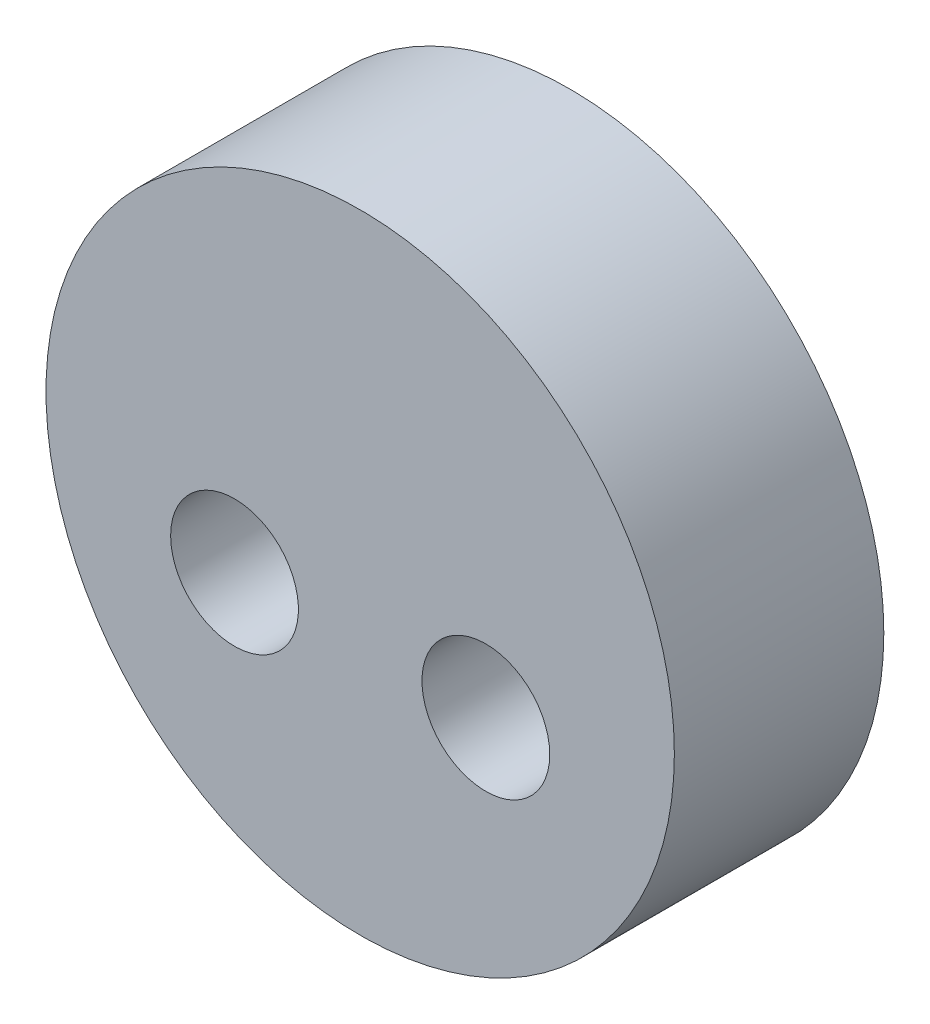
ISO-10303-21;
HEADER;
FILE_DESCRIPTION(('STEP AP214'),'2;1');
FILE_NAME('part.step','',(''),(''),'','','');
FILE_SCHEMA(('AUTOMOTIVE_DESIGN { 1 0 10303 214 1 1 1 1 }'));
ENDSEC;
DATA;
#1=APPLICATION_CONTEXT('core data for automotive mechanical design processes');
#2=APPLICATION_PROTOCOL_DEFINITION('international standard','automotive_design',2000,#1);
#3=PRODUCT_CONTEXT('',#1,'mechanical');
#4=PRODUCT('Part','Part','',(#3));
#5=PRODUCT_RELATED_PRODUCT_CATEGORY('part','',(#4));
#6=PRODUCT_DEFINITION_FORMATION('','',#4);
#7=PRODUCT_DEFINITION_CONTEXT('part definition',#1,'design');
#8=PRODUCT_DEFINITION('design','',#6,#7);
#9=PRODUCT_DEFINITION_SHAPE('','',#8);
#10=(LENGTH_UNIT() NAMED_UNIT(*) SI_UNIT(.MILLI.,.METRE.));
#11=(NAMED_UNIT(*) PLANE_ANGLE_UNIT() SI_UNIT($,.RADIAN.));
#12=(NAMED_UNIT(*) SI_UNIT($,.STERADIAN.) SOLID_ANGLE_UNIT());
#13=UNCERTAINTY_MEASURE_WITH_UNIT(LENGTH_MEASURE(1.E-05),#10,'distance_accuracy_value','');
#14=(GEOMETRIC_REPRESENTATION_CONTEXT(3) GLOBAL_UNCERTAINTY_ASSIGNED_CONTEXT((#13)) GLOBAL_UNIT_ASSIGNED_CONTEXT((#10,
#11,#12)) REPRESENTATION_CONTEXT('',''));
#15=CARTESIAN_POINT('',(0.,0.,0.));
#16=DIRECTION('',(0.,0.,1.));
#17=DIRECTION('',(1.,0.,0.));
#18=AXIS2_PLACEMENT_3D('',#15,#16,#17);
#19=CARTESIAN_POINT('',(0.,0.,5.));
#20=DIRECTION('',(0.,0.,-1.));
#21=DIRECTION('',(-1.,0.,0.));
#22=AXIS2_PLACEMENT_3D('',#19,#20,#21);
#23=CYLINDRICAL_SURFACE('',#22,7.5);
#24=CARTESIAN_POINT('',(0.,0.,5.));
#25=DIRECTION('',(0.,0.,1.));
#26=DIRECTION('',(1.,0.,0.));
#27=AXIS2_PLACEMENT_3D('',#24,#25,#26);
#28=CIRCLE('',#27,7.5);
#29=CARTESIAN_POINT('',(7.5,0.,5.));
#30=VERTEX_POINT('',#29);
#31=EDGE_CURVE('E10',#30,#30,#28,.T.);
#32=ORIENTED_EDGE('',*,*,#31,.F.);
#33=EDGE_LOOP('',(#32));
#34=FACE_BOUND('',#33,.T.);
#35=CARTESIAN_POINT('',(0.,0.,0.));
#36=DIRECTION('',(0.,0.,1.));
#37=DIRECTION('',(1.,0.,0.));
#38=AXIS2_PLACEMENT_3D('',#35,#36,#37);
#39=CIRCLE('',#38,7.5);
#40=CARTESIAN_POINT('',(7.5,0.,0.));
#41=VERTEX_POINT('',#40);
#42=EDGE_CURVE('E39',#41,#41,#39,.T.);
#43=ORIENTED_EDGE('',*,*,#42,.T.);
#44=EDGE_LOOP('',(#43));
#45=FACE_BOUND('',#44,.T.);
#46=ADVANCED_FACE('F36',(#34,#45),#23,.T.);
#47=CARTESIAN_POINT('',(0.,0.,5.));
#48=DIRECTION('',(0.,0.,1.));
#49=DIRECTION('',(1.,0.,0.));
#50=AXIS2_PLACEMENT_3D('',#47,#48,#49);
#51=PLANE('',#50);
#52=CARTESIAN_POINT('',(3.,-1.5,5.));
#53=DIRECTION('',(0.,0.,1.));
#54=DIRECTION('',(1.,0.,0.));
#55=AXIS2_PLACEMENT_3D('',#52,#53,#54);
#56=CIRCLE('',#55,1.525);
#57=CARTESIAN_POINT('',(4.525,-1.5,5.));
#58=VERTEX_POINT('',#57);
#59=EDGE_CURVE('E54',#58,#58,#56,.T.);
#60=ORIENTED_EDGE('',*,*,#59,.F.);
#61=EDGE_LOOP('',(#60));
#62=FACE_BOUND('',#61,.T.);
#63=CARTESIAN_POINT('',(-3.,-1.5,5.));
#64=DIRECTION('',(0.,0.,1.));
#65=DIRECTION('',(-1.,0.,0.));
#66=AXIS2_PLACEMENT_3D('',#63,#64,#65);
#67=CIRCLE('',#66,1.525);
#68=CARTESIAN_POINT('',(-4.525,-1.5,5.));
#69=VERTEX_POINT('',#68);
#70=EDGE_CURVE('E48',#69,#69,#67,.T.);
#71=ORIENTED_EDGE('',*,*,#70,.F.);
#72=EDGE_LOOP('',(#71));
#73=FACE_BOUND('',#72,.T.);
#74=ORIENTED_EDGE('',*,*,#31,.T.);
#75=EDGE_LOOP('',(#74));
#76=FACE_BOUND('',#75,.T.);
#77=ADVANCED_FACE('F70',(#62,#73,#76),#51,.T.);
#78=CARTESIAN_POINT('',(0.,0.,0.));
#79=DIRECTION('',(0.,0.,1.));
#80=DIRECTION('',(1.,0.,0.));
#81=AXIS2_PLACEMENT_3D('',#78,#79,#80);
#82=PLANE('',#81);
#83=CARTESIAN_POINT('',(3.,-1.5,0.));
#84=DIRECTION('',(0.,0.,1.));
#85=DIRECTION('',(1.,0.,0.));
#86=AXIS2_PLACEMENT_3D('',#83,#84,#85);
#87=CIRCLE('',#86,1.525);
#88=CARTESIAN_POINT('',(4.525,-1.5,0.));
#89=VERTEX_POINT('',#88);
#90=EDGE_CURVE('E46',#89,#89,#87,.T.);
#91=ORIENTED_EDGE('',*,*,#90,.T.);
#92=EDGE_LOOP('',(#91));
#93=FACE_BOUND('',#92,.T.);
#94=CARTESIAN_POINT('',(-3.,-1.5,0.));
#95=DIRECTION('',(0.,0.,1.));
#96=DIRECTION('',(-1.,0.,0.));
#97=AXIS2_PLACEMENT_3D('',#94,#95,#96);
#98=CIRCLE('',#97,1.525);
#99=CARTESIAN_POINT('',(-4.525,-1.5,0.));
#100=VERTEX_POINT('',#99);
#101=EDGE_CURVE('E51',#100,#100,#98,.T.);
#102=ORIENTED_EDGE('',*,*,#101,.T.);
#103=EDGE_LOOP('',(#102));
#104=FACE_BOUND('',#103,.T.);
#105=ORIENTED_EDGE('',*,*,#42,.F.);
#106=EDGE_LOOP('',(#105));
#107=FACE_BOUND('',#106,.T.);
#108=ADVANCED_FACE('F60',(#93,#104,#107),#82,.F.);
#109=CARTESIAN_POINT('',(-3.,-1.5,0.));
#110=DIRECTION('',(0.,0.,1.));
#111=DIRECTION('',(1.,0.,0.));
#112=AXIS2_PLACEMENT_3D('',#109,#110,#111);
#113=CYLINDRICAL_SURFACE('',#112,1.525);
#114=ORIENTED_EDGE('',*,*,#101,.F.);
#115=EDGE_LOOP('',(#114));
#116=FACE_BOUND('',#115,.T.);
#117=ORIENTED_EDGE('',*,*,#70,.T.);
#118=EDGE_LOOP('',(#117));
#119=FACE_BOUND('',#118,.T.);
#120=ADVANCED_FACE('F66',(#116,#119),#113,.F.);
#121=CARTESIAN_POINT('',(3.,-1.5,0.));
#122=DIRECTION('',(0.,0.,1.));
#123=DIRECTION('',(1.,0.,0.));
#124=AXIS2_PLACEMENT_3D('',#121,#122,#123);
#125=CYLINDRICAL_SURFACE('',#124,1.525);
#126=ORIENTED_EDGE('',*,*,#90,.F.);
#127=EDGE_LOOP('',(#126));
#128=FACE_BOUND('',#127,.T.);
#129=ORIENTED_EDGE('',*,*,#59,.T.);
#130=EDGE_LOOP('',(#129));
#131=FACE_BOUND('',#130,.T.);
#132=ADVANCED_FACE('F63',(#128,#131),#125,.F.);
#133=CLOSED_SHELL('',(#46,#77,#108,#120,#132));
#134=MANIFOLD_SOLID_BREP('B2',#133);
#135=ADVANCED_BREP_SHAPE_REPRESENTATION('',(#18,#134),#14);
#136=SHAPE_DEFINITION_REPRESENTATION(#9,#135);
ENDSEC;
END-ISO-10303-21;
